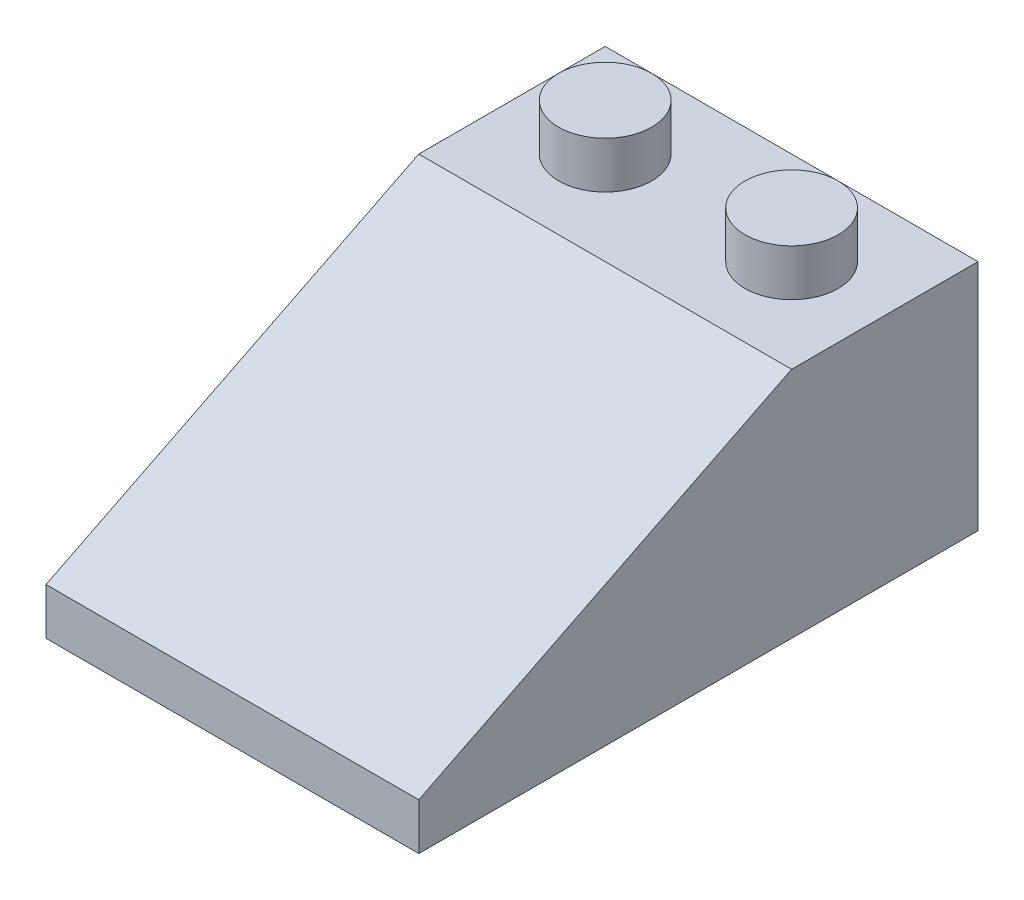
ISO-10303-21;
HEADER;
FILE_DESCRIPTION(('STEP AP214'),'2;1');
FILE_NAME('part.step','',(''),(''),'','','');
FILE_SCHEMA(('AUTOMOTIVE_DESIGN { 1 0 10303 214 1 1 1 1 }'));
ENDSEC;
DATA;
#1=APPLICATION_CONTEXT('core data for automotive mechanical design processes');
#2=APPLICATION_PROTOCOL_DEFINITION('international standard','automotive_design',2000,#1);
#3=PRODUCT_CONTEXT('',#1,'mechanical');
#4=PRODUCT('Part','Part','',(#3));
#5=PRODUCT_RELATED_PRODUCT_CATEGORY('part','',(#4));
#6=PRODUCT_DEFINITION_FORMATION('','',#4);
#7=PRODUCT_DEFINITION_CONTEXT('part definition',#1,'design');
#8=PRODUCT_DEFINITION('design','',#6,#7);
#9=PRODUCT_DEFINITION_SHAPE('','',#8);
#10=(LENGTH_UNIT() NAMED_UNIT(*) SI_UNIT(.MILLI.,.METRE.));
#11=(NAMED_UNIT(*) PLANE_ANGLE_UNIT() SI_UNIT($,.RADIAN.));
#12=(NAMED_UNIT(*) SI_UNIT($,.STERADIAN.) SOLID_ANGLE_UNIT());
#13=UNCERTAINTY_MEASURE_WITH_UNIT(LENGTH_MEASURE(1.E-05),#10,'distance_accuracy_value','');
#14=(GEOMETRIC_REPRESENTATION_CONTEXT(3) GLOBAL_UNCERTAINTY_ASSIGNED_CONTEXT((#13)) GLOBAL_UNIT_ASSIGNED_CONTEXT((#10,
#11,#12)) REPRESENTATION_CONTEXT('',''));
#15=CARTESIAN_POINT('',(0.,0.,0.));
#16=DIRECTION('',(0.,0.,1.));
#17=DIRECTION('',(1.,0.,0.));
#18=AXIS2_PLACEMENT_3D('',#15,#16,#17);
#19=CARTESIAN_POINT('',(16.,0.,24.));
#20=DIRECTION('',(0.,1.,0.));
#21=DIRECTION('',(0.,0.,1.));
#22=AXIS2_PLACEMENT_3D('',#19,#20,#21);
#23=PLANE('',#22);
#24=DIRECTION('',(0.,0.,-1.));
#25=VECTOR('',#24,1.);
#26=CARTESIAN_POINT('',(0.,0.,24.));
#27=LINE('',#26,#25);
#28=CARTESIAN_POINT('',(0.,0.,24.));
#29=VERTEX_POINT('',#28);
#30=CARTESIAN_POINT('',(0.,0.,0.));
#31=VERTEX_POINT('',#30);
#32=EDGE_CURVE('E224',#29,#31,#27,.T.);
#33=ORIENTED_EDGE('',*,*,#32,.T.);
#34=DIRECTION('',(-1.,0.,0.));
#35=VECTOR('',#34,1.);
#36=CARTESIAN_POINT('',(16.,0.,0.));
#37=LINE('',#36,#35);
#38=CARTESIAN_POINT('',(16.,0.,0.));
#39=VERTEX_POINT('',#38);
#40=EDGE_CURVE('E229',#39,#31,#37,.T.);
#41=ORIENTED_EDGE('',*,*,#40,.F.);
#42=DIRECTION('',(0.,0.,-1.));
#43=VECTOR('',#42,1.);
#44=CARTESIAN_POINT('',(16.,0.,24.));
#45=LINE('',#44,#43);
#46=CARTESIAN_POINT('',(16.,0.,24.));
#47=VERTEX_POINT('',#46);
#48=EDGE_CURVE('E213',#47,#39,#45,.T.);
#49=ORIENTED_EDGE('',*,*,#48,.F.);
#50=DIRECTION('',(-1.,0.,0.));
#51=VECTOR('',#50,1.);
#52=CARTESIAN_POINT('',(16.,0.,24.));
#53=LINE('',#52,#51);
#54=EDGE_CURVE('E232',#47,#29,#53,.T.);
#55=ORIENTED_EDGE('',*,*,#54,.T.);
#56=EDGE_LOOP('',(#33,#41,#49,#55));
#57=FACE_BOUND('',#56,.T.);
#58=DIRECTION('',(0.,0.,-1.));
#59=VECTOR('',#58,1.);
#60=CARTESIAN_POINT('',(1.,0.,24.));
#61=LINE('',#60,#59);
#62=CARTESIAN_POINT('',(1.,0.,23.));
#63=VERTEX_POINT('',#62);
#64=CARTESIAN_POINT('',(1.,0.,1.));
#65=VERTEX_POINT('',#64);
#66=EDGE_CURVE('E177',#63,#65,#61,.T.);
#67=ORIENTED_EDGE('',*,*,#66,.F.);
#68=DIRECTION('',(-1.,0.,0.));
#69=VECTOR('',#68,1.);
#70=CARTESIAN_POINT('',(16.,0.,23.));
#71=LINE('',#70,#69);
#72=CARTESIAN_POINT('',(15.,0.,23.));
#73=VERTEX_POINT('',#72);
#74=EDGE_CURVE('E173',#73,#63,#71,.T.);
#75=ORIENTED_EDGE('',*,*,#74,.F.);
#76=DIRECTION('',(0.,0.,-1.));
#77=VECTOR('',#76,1.);
#78=CARTESIAN_POINT('',(15.,0.,24.));
#79=LINE('',#78,#77);
#80=CARTESIAN_POINT('',(15.,0.,1.));
#81=VERTEX_POINT('',#80);
#82=EDGE_CURVE('E180',#73,#81,#79,.T.);
#83=ORIENTED_EDGE('',*,*,#82,.T.);
#84=DIRECTION('',(-1.,0.,0.));
#85=VECTOR('',#84,1.);
#86=CARTESIAN_POINT('',(16.,0.,1.));
#87=LINE('',#86,#85);
#88=EDGE_CURVE('E166',#81,#65,#87,.T.);
#89=ORIENTED_EDGE('',*,*,#88,.T.);
#90=EDGE_LOOP('',(#67,#75,#83,#89));
#91=FACE_BOUND('',#90,.T.);
#92=ADVANCED_FACE('F49',(#57,#91),#23,.F.);
#93=CARTESIAN_POINT('',(16.,10.,0.));
#94=DIRECTION('',(0.,-1.,0.));
#95=DIRECTION('',(0.,0.,-1.));
#96=AXIS2_PLACEMENT_3D('',#93,#94,#95);
#97=PLANE('',#96);
#98=CARTESIAN_POINT('',(12.,10.,4.00000000000001));
#99=DIRECTION('',(0.,-1.,0.));
#100=DIRECTION('',(0.,0.,-1.));
#101=AXIS2_PLACEMENT_3D('',#98,#99,#100);
#102=CIRCLE('',#101,2.);
#103=CARTESIAN_POINT('',(12.,10.,2.00000000000001));
#104=VERTEX_POINT('',#103);
#105=EDGE_CURVE('E57',#104,#104,#102,.F.);
#106=ORIENTED_EDGE('',*,*,#105,.F.);
#107=EDGE_LOOP('',(#106));
#108=FACE_BOUND('',#107,.T.);
#109=CARTESIAN_POINT('',(4.,10.,4.00000000000001));
#110=DIRECTION('',(0.,-1.,0.));
#111=DIRECTION('',(0.,0.,-1.));
#112=AXIS2_PLACEMENT_3D('',#109,#110,#111);
#113=CIRCLE('',#112,2.);
#114=CARTESIAN_POINT('',(4.,10.,2.));
#115=VERTEX_POINT('',#114);
#116=EDGE_CURVE('E241',#115,#115,#113,.F.);
#117=ORIENTED_EDGE('',*,*,#116,.F.);
#118=EDGE_LOOP('',(#117));
#119=FACE_BOUND('',#118,.T.);
#120=DIRECTION('',(0.,0.,1.));
#121=VECTOR('',#120,1.);
#122=CARTESIAN_POINT('',(0.,10.,0.));
#123=LINE('',#122,#121);
#124=CARTESIAN_POINT('',(0.,10.,0.));
#125=VERTEX_POINT('',#124);
#126=CARTESIAN_POINT('',(0.,10.,8.));
#127=VERTEX_POINT('',#126);
#128=EDGE_CURVE('E204',#125,#127,#123,.T.);
#129=ORIENTED_EDGE('',*,*,#128,.T.);
#130=DIRECTION('',(-1.,0.,0.));
#131=VECTOR('',#130,1.);
#132=CARTESIAN_POINT('',(16.,10.,8.));
#133=LINE('',#132,#131);
#134=CARTESIAN_POINT('',(16.,10.,8.));
#135=VERTEX_POINT('',#134);
#136=EDGE_CURVE('E238',#135,#127,#133,.T.);
#137=ORIENTED_EDGE('',*,*,#136,.F.);
#138=DIRECTION('',(0.,0.,1.));
#139=VECTOR('',#138,1.);
#140=CARTESIAN_POINT('',(16.,10.,0.));
#141=LINE('',#140,#139);
#142=CARTESIAN_POINT('',(16.,10.,0.));
#143=VERTEX_POINT('',#142);
#144=EDGE_CURVE('E205',#143,#135,#141,.T.);
#145=ORIENTED_EDGE('',*,*,#144,.F.);
#146=DIRECTION('',(-1.,0.,0.));
#147=VECTOR('',#146,1.);
#148=CARTESIAN_POINT('',(16.,10.,0.));
#149=LINE('',#148,#147);
#150=EDGE_CURVE('E217',#143,#125,#149,.T.);
#151=ORIENTED_EDGE('',*,*,#150,.T.);
#152=EDGE_LOOP('',(#129,#137,#145,#151));
#153=FACE_BOUND('',#152,.T.);
#154=ADVANCED_FACE('F51',(#108,#119,#153),#97,.F.);
#155=CARTESIAN_POINT('',(16.,10.,8.));
#156=DIRECTION('',(0.,-0.894427190999916,-0.447213595499958));
#157=DIRECTION('',(0.,0.447213595499958,-0.894427190999916));
#158=AXIS2_PLACEMENT_3D('',#155,#156,#157);
#159=PLANE('',#158);
#160=DIRECTION('',(0.,-0.447213595499958,0.894427190999916));
#161=VECTOR('',#160,1.);
#162=CARTESIAN_POINT('',(0.,10.,8.));
#163=LINE('',#162,#161);
#164=CARTESIAN_POINT('',(0.,2.,24.));
#165=VERTEX_POINT('',#164);
#166=EDGE_CURVE('E220',#127,#165,#163,.T.);
#167=ORIENTED_EDGE('',*,*,#166,.T.);
#168=DIRECTION('',(-1.,0.,0.));
#169=VECTOR('',#168,1.);
#170=CARTESIAN_POINT('',(16.,2.,24.));
#171=LINE('',#170,#169);
#172=CARTESIAN_POINT('',(16.,2.,24.));
#173=VERTEX_POINT('',#172);
#174=EDGE_CURVE('E235',#173,#165,#171,.T.);
#175=ORIENTED_EDGE('',*,*,#174,.F.);
#176=DIRECTION('',(0.,-0.447213595499958,0.894427190999916));
#177=VECTOR('',#176,1.);
#178=CARTESIAN_POINT('',(16.,10.,8.));
#179=LINE('',#178,#177);
#180=EDGE_CURVE('E208',#135,#173,#179,.T.);
#181=ORIENTED_EDGE('',*,*,#180,.F.);
#182=ORIENTED_EDGE('',*,*,#136,.T.);
#183=EDGE_LOOP('',(#167,#175,#181,#182));
#184=FACE_BOUND('',#183,.T.);
#185=ADVANCED_FACE('F250',(#184),#159,.F.);
#186=CARTESIAN_POINT('',(16.,2.,24.));
#187=DIRECTION('',(0.,0.,-1.));
#188=DIRECTION('',(-1.,0.,0.));
#189=AXIS2_PLACEMENT_3D('',#186,#187,#188);
#190=PLANE('',#189);
#191=DIRECTION('',(0.,-1.,0.));
#192=VECTOR('',#191,1.);
#193=CARTESIAN_POINT('',(0.,2.,24.));
#194=LINE('',#193,#192);
#195=EDGE_CURVE('E222',#165,#29,#194,.T.);
#196=ORIENTED_EDGE('',*,*,#195,.T.);
#197=ORIENTED_EDGE('',*,*,#54,.F.);
#198=DIRECTION('',(0.,-1.,0.));
#199=VECTOR('',#198,1.);
#200=CARTESIAN_POINT('',(16.,2.,24.));
#201=LINE('',#200,#199);
#202=EDGE_CURVE('E211',#173,#47,#201,.T.);
#203=ORIENTED_EDGE('',*,*,#202,.F.);
#204=ORIENTED_EDGE('',*,*,#174,.T.);
#205=EDGE_LOOP('',(#196,#197,#203,#204));
#206=FACE_BOUND('',#205,.T.);
#207=ADVANCED_FACE('F276',(#206),#190,.F.);
#208=CARTESIAN_POINT('',(16.,0.,0.));
#209=DIRECTION('',(0.,0.,1.));
#210=DIRECTION('',(1.,0.,0.));
#211=AXIS2_PLACEMENT_3D('',#208,#209,#210);
#212=PLANE('',#211);
#213=DIRECTION('',(0.,1.,0.));
#214=VECTOR('',#213,1.);
#215=CARTESIAN_POINT('',(0.,0.,0.));
#216=LINE('',#215,#214);
#217=EDGE_CURVE('E209',#31,#125,#216,.T.);
#218=ORIENTED_EDGE('',*,*,#217,.T.);
#219=ORIENTED_EDGE('',*,*,#150,.F.);
#220=DIRECTION('',(0.,1.,0.));
#221=VECTOR('',#220,1.);
#222=CARTESIAN_POINT('',(16.,0.,0.));
#223=LINE('',#222,#221);
#224=EDGE_CURVE('E215',#39,#143,#223,.T.);
#225=ORIENTED_EDGE('',*,*,#224,.F.);
#226=ORIENTED_EDGE('',*,*,#40,.T.);
#227=EDGE_LOOP('',(#218,#219,#225,#226));
#228=FACE_BOUND('',#227,.T.);
#229=ADVANCED_FACE('F271',(#228),#212,.F.);
#230=CARTESIAN_POINT('',(16.,0.,0.));
#231=DIRECTION('',(1.,0.,0.));
#232=DIRECTION('',(0.,0.,-1.));
#233=AXIS2_PLACEMENT_3D('',#230,#231,#232);
#234=PLANE('',#233);
#235=ORIENTED_EDGE('',*,*,#144,.T.);
#236=ORIENTED_EDGE('',*,*,#180,.T.);
#237=ORIENTED_EDGE('',*,*,#202,.T.);
#238=ORIENTED_EDGE('',*,*,#48,.T.);
#239=ORIENTED_EDGE('',*,*,#224,.T.);
#240=EDGE_LOOP('',(#235,#236,#237,#238,#239));
#241=FACE_BOUND('',#240,.T.);
#242=ADVANCED_FACE('F266',(#241),#234,.T.);
#243=CARTESIAN_POINT('',(0.,0.,0.));
#244=DIRECTION('',(1.,0.,0.));
#245=DIRECTION('',(0.,0.,-1.));
#246=AXIS2_PLACEMENT_3D('',#243,#244,#245);
#247=PLANE('',#246);
#248=ORIENTED_EDGE('',*,*,#128,.F.);
#249=ORIENTED_EDGE('',*,*,#217,.F.);
#250=ORIENTED_EDGE('',*,*,#32,.F.);
#251=ORIENTED_EDGE('',*,*,#195,.F.);
#252=ORIENTED_EDGE('',*,*,#166,.F.);
#253=EDGE_LOOP('',(#248,#249,#250,#251,#252));
#254=FACE_BOUND('',#253,.T.);
#255=ADVANCED_FACE('F259',(#254),#247,.F.);
#256=CARTESIAN_POINT('',(4.,12.,4.00000000000001));
#257=DIRECTION('',(0.,-1.,0.));
#258=DIRECTION('',(0.,0.,-1.));
#259=AXIS2_PLACEMENT_3D('',#256,#257,#258);
#260=CYLINDRICAL_SURFACE('',#259,2.);
#261=CARTESIAN_POINT('',(4.,12.,4.00000000000001));
#262=DIRECTION('',(0.,1.,0.));
#263=DIRECTION('',(0.,0.,1.));
#264=AXIS2_PLACEMENT_3D('',#261,#262,#263);
#265=CIRCLE('',#264,2.);
#266=CARTESIAN_POINT('',(4.,12.,6.00000000000001));
#267=VERTEX_POINT('',#266);
#268=EDGE_CURVE('E200',#267,#267,#265,.T.);
#269=ORIENTED_EDGE('',*,*,#268,.F.);
#270=EDGE_LOOP('',(#269));
#271=FACE_BOUND('',#270,.T.);
#272=ORIENTED_EDGE('',*,*,#116,.T.);
#273=EDGE_LOOP('',(#272));
#274=FACE_BOUND('',#273,.T.);
#275=ADVANCED_FACE('F291',(#271,#274),#260,.T.);
#276=CARTESIAN_POINT('',(4.,12.,4.00000000000001));
#277=DIRECTION('',(0.,1.,0.));
#278=DIRECTION('',(0.,0.,1.));
#279=AXIS2_PLACEMENT_3D('',#276,#277,#278);
#280=PLANE('',#279);
#281=ORIENTED_EDGE('',*,*,#268,.T.);
#282=EDGE_LOOP('',(#281));
#283=FACE_BOUND('',#282,.T.);
#284=ADVANCED_FACE('F296',(#283),#280,.T.);
#285=CARTESIAN_POINT('',(12.,12.,4.00000000000001));
#286=DIRECTION('',(0.,-1.,0.));
#287=DIRECTION('',(0.,0.,-1.));
#288=AXIS2_PLACEMENT_3D('',#285,#286,#287);
#289=CYLINDRICAL_SURFACE('',#288,2.);
#290=CARTESIAN_POINT('',(12.,12.,4.00000000000001));
#291=DIRECTION('',(0.,1.,0.));
#292=DIRECTION('',(0.,0.,-1.));
#293=AXIS2_PLACEMENT_3D('',#290,#291,#292);
#294=CIRCLE('',#293,2.);
#295=CARTESIAN_POINT('',(12.,12.,2.00000000000001));
#296=VERTEX_POINT('',#295);
#297=EDGE_CURVE('E197',#296,#296,#294,.T.);
#298=ORIENTED_EDGE('',*,*,#297,.F.);
#299=EDGE_LOOP('',(#298));
#300=FACE_BOUND('',#299,.T.);
#301=ORIENTED_EDGE('',*,*,#105,.T.);
#302=EDGE_LOOP('',(#301));
#303=FACE_BOUND('',#302,.T.);
#304=ADVANCED_FACE('F246',(#300,#303),#289,.T.);
#305=CARTESIAN_POINT('',(12.,12.,4.00000000000001));
#306=DIRECTION('',(0.,-1.,0.));
#307=DIRECTION('',(0.,0.,-1.));
#308=AXIS2_PLACEMENT_3D('',#305,#306,#307);
#309=PLANE('',#308);
#310=ORIENTED_EDGE('',*,*,#297,.T.);
#311=EDGE_LOOP('',(#310));
#312=FACE_BOUND('',#311,.T.);
#313=ADVANCED_FACE('F301',(#312),#309,.F.);
#314=CARTESIAN_POINT('',(16.,9.,0.));
#315=DIRECTION('',(0.,-1.,0.));
#316=DIRECTION('',(0.,0.,-1.));
#317=AXIS2_PLACEMENT_3D('',#314,#315,#316);
#318=PLANE('',#317);
#319=CARTESIAN_POINT('',(8.,9.,8.));
#320=DIRECTION('',(0.,-1.,0.));
#321=DIRECTION('',(0.,0.,-1.));
#322=AXIS2_PLACEMENT_3D('',#319,#320,#321);
#323=CIRCLE('',#322,2.7);
#324=CARTESIAN_POINT('',(10.6896601848559,9.,7.76393202250021));
#325=VERTEX_POINT('',#324);
#326=CARTESIAN_POINT('',(5.31033981514408,9.,7.76393202250021));
#327=VERTEX_POINT('',#326);
#328=EDGE_CURVE('E189',#325,#327,#323,.F.);
#329=ORIENTED_EDGE('',*,*,#328,.T.);
#330=DIRECTION('',(-1.,0.,0.));
#331=VECTOR('',#330,1.);
#332=CARTESIAN_POINT('',(16.,9.,7.76393202250021));
#333=LINE('',#332,#331);
#334=CARTESIAN_POINT('',(1.,9.,7.76393202250021));
#335=VERTEX_POINT('',#334);
#336=EDGE_CURVE('E150',#327,#335,#333,.T.);
#337=ORIENTED_EDGE('',*,*,#336,.T.);
#338=DIRECTION('',(0.,0.,1.));
#339=VECTOR('',#338,1.);
#340=CARTESIAN_POINT('',(1.,9.,0.));
#341=LINE('',#340,#339);
#342=CARTESIAN_POINT('',(1.,9.,1.));
#343=VERTEX_POINT('',#342);
#344=EDGE_CURVE('E156',#343,#335,#341,.T.);
#345=ORIENTED_EDGE('',*,*,#344,.F.);
#346=DIRECTION('',(-1.,0.,0.));
#347=VECTOR('',#346,1.);
#348=CARTESIAN_POINT('',(16.,9.,1.));
#349=LINE('',#348,#347);
#350=CARTESIAN_POINT('',(15.,9.,1.));
#351=VERTEX_POINT('',#350);
#352=EDGE_CURVE('E163',#351,#343,#349,.T.);
#353=ORIENTED_EDGE('',*,*,#352,.F.);
#354=DIRECTION('',(0.,0.,1.));
#355=VECTOR('',#354,1.);
#356=CARTESIAN_POINT('',(15.,9.,0.));
#357=LINE('',#356,#355);
#358=CARTESIAN_POINT('',(15.,9.,7.76393202250021));
#359=VERTEX_POINT('',#358);
#360=EDGE_CURVE('E158',#351,#359,#357,.T.);
#361=ORIENTED_EDGE('',*,*,#360,.T.);
#362=EDGE_CURVE('E149',#359,#325,#333,.T.);
#363=ORIENTED_EDGE('',*,*,#362,.T.);
#364=EDGE_LOOP('',(#329,#337,#345,#353,#361,#363));
#365=FACE_BOUND('',#364,.T.);
#366=CARTESIAN_POINT('',(12.,9.,4.));
#367=DIRECTION('',(0.,-1.,0.));
#368=DIRECTION('',(0.,0.,-1.));
#369=AXIS2_PLACEMENT_3D('',#366,#367,#368);
#370=CIRCLE('',#369,1.);
#371=CARTESIAN_POINT('',(12.,9.,3.));
#372=VERTEX_POINT('',#371);
#373=EDGE_CURVE('E201',#372,#372,#370,.F.);
#374=ORIENTED_EDGE('',*,*,#373,.T.);
#375=EDGE_LOOP('',(#374));
#376=FACE_BOUND('',#375,.T.);
#377=CARTESIAN_POINT('',(4.,9.,4.));
#378=DIRECTION('',(0.,-1.,0.));
#379=DIRECTION('',(0.,0.,-1.));
#380=AXIS2_PLACEMENT_3D('',#377,#378,#379);
#381=CIRCLE('',#380,1.);
#382=CARTESIAN_POINT('',(4.,9.,3.));
#383=VERTEX_POINT('',#382);
#384=EDGE_CURVE('E152',#383,#383,#381,.F.);
#385=ORIENTED_EDGE('',*,*,#384,.T.);
#386=EDGE_LOOP('',(#385));
#387=FACE_BOUND('',#386,.T.);
#388=ADVANCED_FACE('F304',(#365,#376,#387),#318,.T.);
#389=CARTESIAN_POINT('',(16.,9.10557280900008,7.55278640450004));
#390=DIRECTION('',(0.,-0.894427190999916,-0.447213595499958));
#391=DIRECTION('',(0.,0.447213595499958,-0.894427190999916));
#392=AXIS2_PLACEMENT_3D('',#389,#390,#391);
#393=PLANE('',#392);
#394=CARTESIAN_POINT('',(8.,4.88196601125011,16.));
#395=DIRECTION('',(0.,-0.894427190999916,-0.447213595499958));
#396=DIRECTION('',(0.,-0.447213595499958,0.894427190999916));
#397=AXIS2_PLACEMENT_3D('',#394,#395,#396);
#398=ELLIPSE('',#397,3.01869176962471,2.7);
#399=CARTESIAN_POINT('',(8.,3.53196601125011,18.7));
#400=VERTEX_POINT('',#399);
#401=EDGE_CURVE('E12',#400,#400,#398,.T.);
#402=ORIENTED_EDGE('',*,*,#401,.F.);
#403=EDGE_LOOP('',(#402));
#404=FACE_BOUND('',#403,.T.);
#405=CARTESIAN_POINT('',(8.,8.88196601125011,8.));
#406=DIRECTION('',(0.,-0.894427190999916,-0.447213595499958));
#407=DIRECTION('',(0.,-0.447213595499958,0.894427190999916));
#408=AXIS2_PLACEMENT_3D('',#405,#406,#407);
#409=ELLIPSE('',#408,3.01869176962472,2.7);
#410=EDGE_CURVE('E71',#327,#325,#409,.F.);
#411=ORIENTED_EDGE('',*,*,#410,.T.);
#412=ORIENTED_EDGE('',*,*,#362,.F.);
#413=DIRECTION('',(0.,-0.447213595499958,0.894427190999916));
#414=VECTOR('',#413,1.);
#415=CARTESIAN_POINT('',(15.,9.10557280900008,7.55278640450004));
#416=LINE('',#415,#414);
#417=CARTESIAN_POINT('',(15.,1.38196601125011,23.));
#418=VERTEX_POINT('',#417);
#419=EDGE_CURVE('E161',#359,#418,#416,.T.);
#420=ORIENTED_EDGE('',*,*,#419,.T.);
#421=DIRECTION('',(-1.,0.,0.));
#422=VECTOR('',#421,1.);
#423=CARTESIAN_POINT('',(16.,1.38196601125011,23.));
#424=LINE('',#423,#422);
#425=CARTESIAN_POINT('',(1.,1.38196601125011,23.));
#426=VERTEX_POINT('',#425);
#427=EDGE_CURVE('E153',#418,#426,#424,.T.);
#428=ORIENTED_EDGE('',*,*,#427,.T.);
#429=DIRECTION('',(0.,-0.447213595499958,0.894427190999916));
#430=VECTOR('',#429,1.);
#431=CARTESIAN_POINT('',(1.,9.10557280900008,7.55278640450004));
#432=LINE('',#431,#430);
#433=EDGE_CURVE('E168',#335,#426,#432,.T.);
#434=ORIENTED_EDGE('',*,*,#433,.F.);
#435=ORIENTED_EDGE('',*,*,#336,.F.);
#436=EDGE_LOOP('',(#411,#412,#420,#428,#434,#435));
#437=FACE_BOUND('',#436,.T.);
#438=ADVANCED_FACE('F341',(#404,#437),#393,.T.);
#439=CARTESIAN_POINT('',(16.,2.,23.));
#440=DIRECTION('',(0.,0.,-1.));
#441=DIRECTION('',(-1.,0.,0.));
#442=AXIS2_PLACEMENT_3D('',#439,#440,#441);
#443=PLANE('',#442);
#444=DIRECTION('',(0.,-1.,0.));
#445=VECTOR('',#444,1.);
#446=CARTESIAN_POINT('',(1.,2.,23.));
#447=LINE('',#446,#445);
#448=EDGE_CURVE('E170',#426,#63,#447,.T.);
#449=ORIENTED_EDGE('',*,*,#448,.F.);
#450=ORIENTED_EDGE('',*,*,#427,.F.);
#451=DIRECTION('',(0.,-1.,0.));
#452=VECTOR('',#451,1.);
#453=CARTESIAN_POINT('',(15.,2.,23.));
#454=LINE('',#453,#452);
#455=EDGE_CURVE('E175',#418,#73,#454,.T.);
#456=ORIENTED_EDGE('',*,*,#455,.T.);
#457=ORIENTED_EDGE('',*,*,#74,.T.);
#458=EDGE_LOOP('',(#449,#450,#456,#457));
#459=FACE_BOUND('',#458,.T.);
#460=ADVANCED_FACE('F337',(#459),#443,.T.);
#461=CARTESIAN_POINT('',(16.,0.,1.));
#462=DIRECTION('',(0.,0.,1.));
#463=DIRECTION('',(1.,0.,0.));
#464=AXIS2_PLACEMENT_3D('',#461,#462,#463);
#465=PLANE('',#464);
#466=DIRECTION('',(0.,1.,0.));
#467=VECTOR('',#466,1.);
#468=CARTESIAN_POINT('',(1.,0.,1.));
#469=LINE('',#468,#467);
#470=EDGE_CURVE('E162',#65,#343,#469,.T.);
#471=ORIENTED_EDGE('',*,*,#470,.F.);
#472=ORIENTED_EDGE('',*,*,#88,.F.);
#473=DIRECTION('',(0.,1.,0.));
#474=VECTOR('',#473,1.);
#475=CARTESIAN_POINT('',(15.,0.,1.));
#476=LINE('',#475,#474);
#477=EDGE_CURVE('E167',#81,#351,#476,.T.);
#478=ORIENTED_EDGE('',*,*,#477,.T.);
#479=ORIENTED_EDGE('',*,*,#352,.T.);
#480=EDGE_LOOP('',(#471,#472,#478,#479));
#481=FACE_BOUND('',#480,.T.);
#482=ADVANCED_FACE('F333',(#481),#465,.T.);
#483=CARTESIAN_POINT('',(15.,0.,0.));
#484=DIRECTION('',(1.,0.,0.));
#485=DIRECTION('',(0.,0.,-1.));
#486=AXIS2_PLACEMENT_3D('',#483,#484,#485);
#487=PLANE('',#486);
#488=ORIENTED_EDGE('',*,*,#360,.F.);
#489=ORIENTED_EDGE('',*,*,#477,.F.);
#490=ORIENTED_EDGE('',*,*,#82,.F.);
#491=ORIENTED_EDGE('',*,*,#455,.F.);
#492=ORIENTED_EDGE('',*,*,#419,.F.);
#493=EDGE_LOOP('',(#488,#489,#490,#491,#492));
#494=FACE_BOUND('',#493,.T.);
#495=ADVANCED_FACE('F329',(#494),#487,.F.);
#496=CARTESIAN_POINT('',(1.,0.,0.));
#497=DIRECTION('',(1.,0.,0.));
#498=DIRECTION('',(0.,0.,-1.));
#499=AXIS2_PLACEMENT_3D('',#496,#497,#498);
#500=PLANE('',#499);
#501=ORIENTED_EDGE('',*,*,#344,.T.);
#502=ORIENTED_EDGE('',*,*,#433,.T.);
#503=ORIENTED_EDGE('',*,*,#448,.T.);
#504=ORIENTED_EDGE('',*,*,#66,.T.);
#505=ORIENTED_EDGE('',*,*,#470,.T.);
#506=EDGE_LOOP('',(#501,#502,#503,#504,#505));
#507=FACE_BOUND('',#506,.T.);
#508=ADVANCED_FACE('F325',(#507),#500,.T.);
#509=CARTESIAN_POINT('',(4.,12.,4.00000000000001));
#510=DIRECTION('',(0.,-1.,0.));
#511=DIRECTION('',(0.,0.,-1.));
#512=AXIS2_PLACEMENT_3D('',#509,#510,#511);
#513=CYLINDRICAL_SURFACE('',#512,1.);
#514=CARTESIAN_POINT('',(4.,11.,4.00000000000001));
#515=DIRECTION('',(0.,1.,0.));
#516=DIRECTION('',(0.,0.,1.));
#517=AXIS2_PLACEMENT_3D('',#514,#515,#516);
#518=CIRCLE('',#517,1.);
#519=CARTESIAN_POINT('',(4.,11.,5.00000000000001));
#520=VERTEX_POINT('',#519);
#521=EDGE_CURVE('E183',#520,#520,#518,.T.);
#522=ORIENTED_EDGE('',*,*,#521,.T.);
#523=EDGE_LOOP('',(#522));
#524=FACE_BOUND('',#523,.T.);
#525=ORIENTED_EDGE('',*,*,#384,.F.);
#526=EDGE_LOOP('',(#525));
#527=FACE_BOUND('',#526,.T.);
#528=ADVANCED_FACE('F321',(#524,#527),#513,.F.);
#529=CARTESIAN_POINT('',(4.,11.,4.00000000000001));
#530=DIRECTION('',(0.,1.,0.));
#531=DIRECTION('',(0.,0.,1.));
#532=AXIS2_PLACEMENT_3D('',#529,#530,#531);
#533=PLANE('',#532);
#534=ORIENTED_EDGE('',*,*,#521,.F.);
#535=EDGE_LOOP('',(#534));
#536=FACE_BOUND('',#535,.T.);
#537=ADVANCED_FACE('F317',(#536),#533,.F.);
#538=CARTESIAN_POINT('',(12.,12.,4.00000000000001));
#539=DIRECTION('',(0.,-1.,0.));
#540=DIRECTION('',(0.,0.,-1.));
#541=AXIS2_PLACEMENT_3D('',#538,#539,#540);
#542=CYLINDRICAL_SURFACE('',#541,1.);
#543=CARTESIAN_POINT('',(12.,11.,4.00000000000001));
#544=DIRECTION('',(0.,-1.,0.));
#545=DIRECTION('',(0.,0.,-1.));
#546=AXIS2_PLACEMENT_3D('',#543,#544,#545);
#547=CIRCLE('',#546,1.);
#548=CARTESIAN_POINT('',(12.,11.,3.00000000000001));
#549=VERTEX_POINT('',#548);
#550=EDGE_CURVE('E186',#549,#549,#547,.F.);
#551=ORIENTED_EDGE('',*,*,#550,.T.);
#552=EDGE_LOOP('',(#551));
#553=FACE_BOUND('',#552,.T.);
#554=ORIENTED_EDGE('',*,*,#373,.F.);
#555=EDGE_LOOP('',(#554));
#556=FACE_BOUND('',#555,.T.);
#557=ADVANCED_FACE('F313',(#553,#556),#542,.F.);
#558=CARTESIAN_POINT('',(12.,11.,4.00000000000001));
#559=DIRECTION('',(0.,-1.,0.));
#560=DIRECTION('',(0.,0.,-1.));
#561=AXIS2_PLACEMENT_3D('',#558,#559,#560);
#562=PLANE('',#561);
#563=ORIENTED_EDGE('',*,*,#550,.F.);
#564=EDGE_LOOP('',(#563));
#565=FACE_BOUND('',#564,.T.);
#566=ADVANCED_FACE('F309',(#565),#562,.T.);
#567=CARTESIAN_POINT('',(8.,0.,8.));
#568=DIRECTION('',(0.,-1.,0.));
#569=DIRECTION('',(0.,0.,-1.));
#570=AXIS2_PLACEMENT_3D('',#567,#568,#569);
#571=PLANE('',#570);
#572=CARTESIAN_POINT('',(8.,0.,8.));
#573=DIRECTION('',(0.,-1.,0.));
#574=DIRECTION('',(0.,0.,-1.));
#575=AXIS2_PLACEMENT_3D('',#572,#573,#574);
#576=CIRCLE('',#575,1.7);
#577=CARTESIAN_POINT('',(8.,0.,6.3));
#578=VERTEX_POINT('',#577);
#579=EDGE_CURVE('E146',#578,#578,#576,.T.);
#580=ORIENTED_EDGE('',*,*,#579,.F.);
#581=EDGE_LOOP('',(#580));
#582=FACE_BOUND('',#581,.T.);
#583=CARTESIAN_POINT('',(8.,0.,8.));
#584=DIRECTION('',(0.,-1.,0.));
#585=DIRECTION('',(0.,0.,-1.));
#586=AXIS2_PLACEMENT_3D('',#583,#584,#585);
#587=CIRCLE('',#586,2.7);
#588=CARTESIAN_POINT('',(8.,0.,5.3));
#589=VERTEX_POINT('',#588);
#590=EDGE_CURVE('E378',#589,#589,#587,.T.);
#591=ORIENTED_EDGE('',*,*,#590,.T.);
#592=EDGE_LOOP('',(#591));
#593=FACE_BOUND('',#592,.T.);
#594=ADVANCED_FACE('F312',(#582,#593),#571,.T.);
#595=CARTESIAN_POINT('',(8.,12.002,8.));
#596=DIRECTION('',(0.,-1.,0.));
#597=DIRECTION('',(0.,0.,-1.));
#598=AXIS2_PLACEMENT_3D('',#595,#596,#597);
#599=CYLINDRICAL_SURFACE('',#598,2.7);
#600=ORIENTED_EDGE('',*,*,#410,.F.);
#601=ORIENTED_EDGE('',*,*,#328,.F.);
#602=EDGE_LOOP('',(#600,#601));
#603=FACE_BOUND('',#602,.T.);
#604=ORIENTED_EDGE('',*,*,#590,.F.);
#605=EDGE_LOOP('',(#604));
#606=FACE_BOUND('',#605,.T.);
#607=ADVANCED_FACE('F350',(#603,#606),#599,.T.);
#608=CARTESIAN_POINT('',(8.,12.002,8.));
#609=DIRECTION('',(0.,-1.,0.));
#610=DIRECTION('',(0.,0.,-1.));
#611=AXIS2_PLACEMENT_3D('',#608,#609,#610);
#612=CYLINDRICAL_SURFACE('',#611,1.7);
#613=CARTESIAN_POINT('',(8.,9.,8.));
#614=DIRECTION('',(0.,-1.,0.));
#615=DIRECTION('',(0.,0.,-1.));
#616=AXIS2_PLACEMENT_3D('',#613,#614,#615);
#617=CIRCLE('',#616,1.7);
#618=CARTESIAN_POINT('',(9.68352959878915,9.,7.76393202250021));
#619=VERTEX_POINT('',#618);
#620=CARTESIAN_POINT('',(6.31647040121086,9.,7.76393202250021));
#621=VERTEX_POINT('',#620);
#622=EDGE_CURVE('E63',#619,#621,#617,.F.);
#623=ORIENTED_EDGE('',*,*,#622,.T.);
#624=CARTESIAN_POINT('',(8.,8.88196601125011,8.));
#625=DIRECTION('',(0.,-0.894427190999916,-0.447213595499958));
#626=DIRECTION('',(0.,-0.447213595499958,0.894427190999916));
#627=AXIS2_PLACEMENT_3D('',#624,#625,#626);
#628=ELLIPSE('',#627,1.90065778087482,1.7);
#629=EDGE_CURVE('E136',#621,#619,#628,.F.);
#630=ORIENTED_EDGE('',*,*,#629,.T.);
#631=EDGE_LOOP('',(#623,#630));
#632=FACE_BOUND('',#631,.T.);
#633=ORIENTED_EDGE('',*,*,#579,.T.);
#634=EDGE_LOOP('',(#633));
#635=FACE_BOUND('',#634,.T.);
#636=ADVANCED_FACE('F137',(#632,#635),#612,.F.);
#637=EDGE_CURVE('E145',#619,#621,#333,.T.);
#638=ORIENTED_EDGE('',*,*,#637,.F.);
#639=ORIENTED_EDGE('',*,*,#629,.F.);
#640=EDGE_LOOP('',(#638,#639));
#641=FACE_BOUND('',#640,.T.);
#642=ADVANCED_FACE('F148',(#641),#393,.T.);
#643=ORIENTED_EDGE('',*,*,#637,.T.);
#644=ORIENTED_EDGE('',*,*,#622,.F.);
#645=EDGE_LOOP('',(#643,#644));
#646=FACE_BOUND('',#645,.T.);
#647=ADVANCED_FACE('F144',(#646),#318,.T.);
#648=CARTESIAN_POINT('',(8.,0.,16.));
#649=DIRECTION('',(0.,1.,0.));
#650=DIRECTION('',(0.,0.,1.));
#651=AXIS2_PLACEMENT_3D('',#648,#649,#650);
#652=PLANE('',#651);
#653=CARTESIAN_POINT('',(8.,0.,16.));
#654=DIRECTION('',(0.,-1.,0.));
#655=DIRECTION('',(0.,0.,1.));
#656=AXIS2_PLACEMENT_3D('',#653,#654,#655);
#657=CIRCLE('',#656,1.7);
#658=CARTESIAN_POINT('',(8.,0.,17.7));
#659=VERTEX_POINT('',#658);
#660=EDGE_CURVE('E379',#659,#659,#657,.T.);
#661=ORIENTED_EDGE('',*,*,#660,.F.);
#662=EDGE_LOOP('',(#661));
#663=FACE_BOUND('',#662,.T.);
#664=CARTESIAN_POINT('',(8.,0.,16.));
#665=DIRECTION('',(0.,-1.,0.));
#666=DIRECTION('',(0.,0.,1.));
#667=AXIS2_PLACEMENT_3D('',#664,#665,#666);
#668=CIRCLE('',#667,2.7);
#669=CARTESIAN_POINT('',(8.,0.,18.7));
#670=VERTEX_POINT('',#669);
#671=EDGE_CURVE('E376',#670,#670,#668,.T.);
#672=ORIENTED_EDGE('',*,*,#671,.T.);
#673=EDGE_LOOP('',(#672));
#674=FACE_BOUND('',#673,.T.);
#675=ADVANCED_FACE('F359',(#663,#674),#652,.F.);
#676=CARTESIAN_POINT('',(8.,12.002,16.));
#677=DIRECTION('',(0.,-1.,0.));
#678=DIRECTION('',(0.,0.,-1.));
#679=AXIS2_PLACEMENT_3D('',#676,#677,#678);
#680=CYLINDRICAL_SURFACE('',#679,2.7);
#681=ORIENTED_EDGE('',*,*,#401,.T.);
#682=EDGE_LOOP('',(#681));
#683=FACE_BOUND('',#682,.T.);
#684=ORIENTED_EDGE('',*,*,#671,.F.);
#685=EDGE_LOOP('',(#684));
#686=FACE_BOUND('',#685,.T.);
#687=ADVANCED_FACE('F362',(#683,#686),#680,.T.);
#688=CARTESIAN_POINT('',(8.,12.002,16.));
#689=DIRECTION('',(0.,-1.,0.));
#690=DIRECTION('',(0.,0.,-1.));
#691=AXIS2_PLACEMENT_3D('',#688,#689,#690);
#692=CYLINDRICAL_SURFACE('',#691,1.7);
#693=CARTESIAN_POINT('',(8.,4.88196601125011,16.));
#694=DIRECTION('',(0.,-0.894427190999916,-0.447213595499958));
#695=DIRECTION('',(0.,-0.447213595499958,0.894427190999916));
#696=AXIS2_PLACEMENT_3D('',#693,#694,#695);
#697=ELLIPSE('',#696,1.90065778087482,1.7);
#698=CARTESIAN_POINT('',(8.,4.0319660112501,17.7));
#699=VERTEX_POINT('',#698);
#700=EDGE_CURVE('E384',#699,#699,#697,.F.);
#701=ORIENTED_EDGE('',*,*,#700,.T.);
#702=EDGE_LOOP('',(#701));
#703=FACE_BOUND('',#702,.T.);
#704=ORIENTED_EDGE('',*,*,#660,.T.);
#705=EDGE_LOOP('',(#704));
#706=FACE_BOUND('',#705,.T.);
#707=ADVANCED_FACE('F364',(#703,#706),#692,.F.);
#708=ORIENTED_EDGE('',*,*,#700,.F.);
#709=EDGE_LOOP('',(#708));
#710=FACE_BOUND('',#709,.T.);
#711=ADVANCED_FACE('F346',(#710),#393,.T.);
#712=CLOSED_SHELL('',(#92,#154,#185,#207,#229,#242,#255,#275,#284,#304,#313,#388,#438,#460,#482,
#495,#508,#528,#537,#557,#566,#594,#607,#636,#642,#647,#675,#687,#707,#711));
#713=MANIFOLD_SOLID_BREP('B2',#712);
#714=ADVANCED_BREP_SHAPE_REPRESENTATION('',(#18,#713),#14);
#715=SHAPE_DEFINITION_REPRESENTATION(#9,#714);
ENDSEC;
END-ISO-10303-21;
